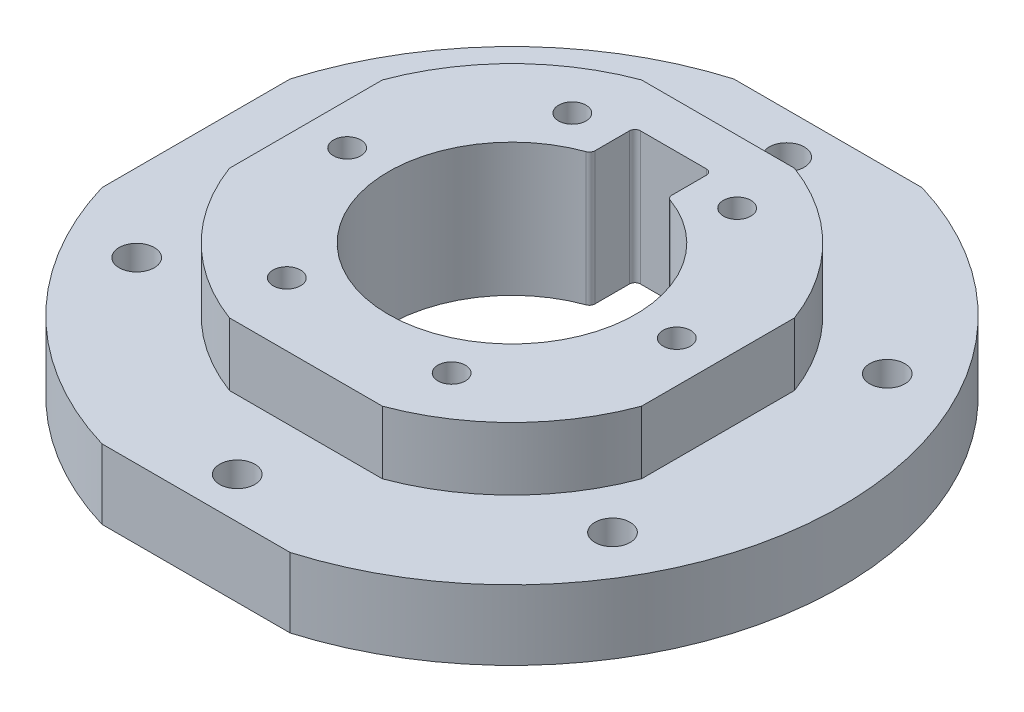
ISO-10303-21;
HEADER;
FILE_DESCRIPTION(('STEP AP214'),'2;1');
FILE_NAME('part.step','',(''),(''),'','','');
FILE_SCHEMA(('AUTOMOTIVE_DESIGN { 1 0 10303 214 1 1 1 1 }'));
ENDSEC;
DATA;
#1=APPLICATION_CONTEXT('core data for automotive mechanical design processes');
#2=APPLICATION_PROTOCOL_DEFINITION('international standard','automotive_design',2000,#1);
#3=PRODUCT_CONTEXT('',#1,'mechanical');
#4=PRODUCT('Part','Part','',(#3));
#5=PRODUCT_RELATED_PRODUCT_CATEGORY('part','',(#4));
#6=PRODUCT_DEFINITION_FORMATION('','',#4);
#7=PRODUCT_DEFINITION_CONTEXT('part definition',#1,'design');
#8=PRODUCT_DEFINITION('design','',#6,#7);
#9=PRODUCT_DEFINITION_SHAPE('','',#8);
#10=(LENGTH_UNIT() NAMED_UNIT(*) SI_UNIT(.MILLI.,.METRE.));
#11=(NAMED_UNIT(*) PLANE_ANGLE_UNIT() SI_UNIT($,.RADIAN.));
#12=(NAMED_UNIT(*) SI_UNIT($,.STERADIAN.) SOLID_ANGLE_UNIT());
#13=UNCERTAINTY_MEASURE_WITH_UNIT(LENGTH_MEASURE(1.E-05),#10,'distance_accuracy_value','');
#14=(GEOMETRIC_REPRESENTATION_CONTEXT(3) GLOBAL_UNCERTAINTY_ASSIGNED_CONTEXT((#13)) GLOBAL_UNIT_ASSIGNED_CONTEXT((#10,
#11,#12)) REPRESENTATION_CONTEXT('',''));
#15=CARTESIAN_POINT('',(0.,0.,0.));
#16=DIRECTION('',(0.,0.,1.));
#17=DIRECTION('',(1.,0.,0.));
#18=AXIS2_PLACEMENT_3D('',#15,#16,#17);
#19=CARTESIAN_POINT('',(0.,-12.7,0.));
#20=DIRECTION('',(0.,1.,0.));
#21=DIRECTION('',(0.,0.,1.));
#22=AXIS2_PLACEMENT_3D('',#19,#20,#21);
#23=CYLINDRICAL_SURFACE('',#22,22.5);
#24=CARTESIAN_POINT('',(0.,11.45,0.));
#25=DIRECTION('',(0.,1.,0.));
#26=DIRECTION('',(0.,0.,1.));
#27=AXIS2_PLACEMENT_3D('',#24,#25,#26);
#28=CIRCLE('',#27,22.5);
#29=CARTESIAN_POINT('',(-7.65957446808511,11.45,-21.1561083133893));
#30=VERTEX_POINT('',#29);
#31=CARTESIAN_POINT('',(7.65957446808511,11.45,-21.1561083133893));
#32=VERTEX_POINT('',#31);
#33=EDGE_CURVE('E414',#30,#32,#28,.T.);
#34=ORIENTED_EDGE('',*,*,#33,.T.);
#35=DIRECTION('',(0.,1.,0.));
#36=VECTOR('',#35,1.);
#37=CARTESIAN_POINT('',(7.65957446808511,-12.7,-21.1561083133893));
#38=LINE('',#37,#36);
#39=CARTESIAN_POINT('',(7.65957446808511,-12.7,-21.1561083133893));
#40=VERTEX_POINT('',#39);
#41=EDGE_CURVE('E57',#32,#40,#38,.F.);
#42=ORIENTED_EDGE('',*,*,#41,.T.);
#43=CARTESIAN_POINT('',(0.,-12.7,0.));
#44=DIRECTION('',(0.,1.,0.));
#45=DIRECTION('',(0.,0.,1.));
#46=AXIS2_PLACEMENT_3D('',#43,#44,#45);
#47=CIRCLE('',#46,22.5);
#48=CARTESIAN_POINT('',(-7.65957446808511,-12.7,-21.1561083133893));
#49=VERTEX_POINT('',#48);
#50=EDGE_CURVE('E295',#49,#40,#47,.T.);
#51=ORIENTED_EDGE('',*,*,#50,.F.);
#52=DIRECTION('',(0.,1.,0.));
#53=VECTOR('',#52,1.);
#54=CARTESIAN_POINT('',(-7.65957446808511,-12.7,-21.1561083133893));
#55=LINE('',#54,#53);
#56=EDGE_CURVE('E371',#49,#30,#55,.T.);
#57=ORIENTED_EDGE('',*,*,#56,.T.);
#58=EDGE_LOOP('',(#34,#42,#51,#57));
#59=FACE_BOUND('',#58,.T.);
#60=ADVANCED_FACE('F41',(#59),#23,.F.);
#61=CARTESIAN_POINT('',(7.00000000000001,-12.7,0.));
#62=DIRECTION('',(-1.,0.,0.));
#63=DIRECTION('',(0.,0.,1.));
#64=AXIS2_PLACEMENT_3D('',#61,#62,#63);
#65=PLANE('',#64);
#66=DIRECTION('',(0.,0.,1.));
#67=VECTOR('',#66,1.);
#68=CARTESIAN_POINT('',(7.00000000000001,11.45,0.));
#69=LINE('',#68,#67);
#70=CARTESIAN_POINT('',(7.,11.45,-28.3834047803431));
#71=VERTEX_POINT('',#70);
#72=CARTESIAN_POINT('',(7.,11.45,-22.0963797939844));
#73=VERTEX_POINT('',#72);
#74=EDGE_CURVE('E215',#71,#73,#69,.T.);
#75=ORIENTED_EDGE('',*,*,#74,.F.);
#76=DIRECTION('',(0.,1.,0.));
#77=VECTOR('',#76,1.);
#78=CARTESIAN_POINT('',(7.,-12.7,-28.3834047803431));
#79=LINE('',#78,#77);
#80=CARTESIAN_POINT('',(7.,-12.7,-28.3834047803431));
#81=VERTEX_POINT('',#80);
#82=EDGE_CURVE('E355',#71,#81,#79,.F.);
#83=ORIENTED_EDGE('',*,*,#82,.T.);
#84=DIRECTION('',(0.,0.,1.));
#85=VECTOR('',#84,1.);
#86=CARTESIAN_POINT('',(7.00000000000001,-12.7,0.));
#87=LINE('',#86,#85);
#88=CARTESIAN_POINT('',(7.,-12.7,-22.0963797939844));
#89=VERTEX_POINT('',#88);
#90=EDGE_CURVE('E306',#81,#89,#87,.T.);
#91=ORIENTED_EDGE('',*,*,#90,.T.);
#92=DIRECTION('',(0.,-1.,0.));
#93=VECTOR('',#92,1.);
#94=CARTESIAN_POINT('',(7.,11.45,-22.0963797939844));
#95=LINE('',#94,#93);
#96=EDGE_CURVE('E351',#89,#73,#95,.F.);
#97=ORIENTED_EDGE('',*,*,#96,.T.);
#98=EDGE_LOOP('',(#75,#83,#91,#97));
#99=FACE_BOUND('',#98,.T.);
#100=ADVANCED_FACE('F516',(#99),#65,.T.);
#101=CARTESIAN_POINT('',(0.,-12.7,-29.3834047803431));
#102=DIRECTION('',(0.,0.,1.));
#103=DIRECTION('',(1.,0.,0.));
#104=AXIS2_PLACEMENT_3D('',#101,#102,#103);
#105=PLANE('',#104);
#106=DIRECTION('',(1.,0.,0.));
#107=VECTOR('',#106,1.);
#108=CARTESIAN_POINT('',(0.,-12.7,-29.3834047803431));
#109=LINE('',#108,#107);
#110=CARTESIAN_POINT('',(-6.,-12.7,-29.3834047803431));
#111=VERTEX_POINT('',#110);
#112=CARTESIAN_POINT('',(6.,-12.7,-29.3834047803431));
#113=VERTEX_POINT('',#112);
#114=EDGE_CURVE('E302',#111,#113,#109,.T.);
#115=ORIENTED_EDGE('',*,*,#114,.T.);
#116=DIRECTION('',(0.,1.,0.));
#117=VECTOR('',#116,1.);
#118=CARTESIAN_POINT('',(6.,11.45,-29.3834047803431));
#119=LINE('',#118,#117);
#120=CARTESIAN_POINT('',(6.,11.45,-29.3834047803431));
#121=VERTEX_POINT('',#120);
#122=EDGE_CURVE('E347',#113,#121,#119,.T.);
#123=ORIENTED_EDGE('',*,*,#122,.T.);
#124=DIRECTION('',(1.,0.,0.));
#125=VECTOR('',#124,1.);
#126=CARTESIAN_POINT('',(0.,11.45,-29.3834047803431));
#127=LINE('',#126,#125);
#128=CARTESIAN_POINT('',(-6.,11.45,-29.3834047803431));
#129=VERTEX_POINT('',#128);
#130=EDGE_CURVE('E393',#129,#121,#127,.T.);
#131=ORIENTED_EDGE('',*,*,#130,.F.);
#132=DIRECTION('',(0.,1.,0.));
#133=VECTOR('',#132,1.);
#134=CARTESIAN_POINT('',(-6.,-12.7,-29.3834047803431));
#135=LINE('',#134,#133);
#136=EDGE_CURVE('E330',#129,#111,#135,.F.);
#137=ORIENTED_EDGE('',*,*,#136,.T.);
#138=EDGE_LOOP('',(#115,#123,#131,#137));
#139=FACE_BOUND('',#138,.T.);
#140=ADVANCED_FACE('F400',(#139),#105,.T.);
#141=CARTESIAN_POINT('',(0.,-12.7,57.5));
#142=DIRECTION('',(0.,0.,1.));
#143=DIRECTION('',(1.,0.,0.));
#144=AXIS2_PLACEMENT_3D('',#141,#142,#143);
#145=PLANE('',#144);
#146=DIRECTION('',(1.,0.,0.));
#147=VECTOR('',#146,1.);
#148=CARTESIAN_POINT('',(0.,0.,57.5));
#149=LINE('',#148,#147);
#150=CARTESIAN_POINT('',(-17.1391365010026,0.,57.5));
#151=VERTEX_POINT('',#150);
#152=CARTESIAN_POINT('',(17.1391365010026,0.,57.5));
#153=VERTEX_POINT('',#152);
#154=EDGE_CURVE('E276',#151,#153,#149,.T.);
#155=ORIENTED_EDGE('',*,*,#154,.F.);
#156=DIRECTION('',(0.,1.,0.));
#157=VECTOR('',#156,1.);
#158=CARTESIAN_POINT('',(-17.1391365010026,-12.7,57.5));
#159=LINE('',#158,#157);
#160=CARTESIAN_POINT('',(-17.1391365010026,-12.7,57.5));
#161=VERTEX_POINT('',#160);
#162=EDGE_CURVE('E327',#161,#151,#159,.T.);
#163=ORIENTED_EDGE('',*,*,#162,.F.);
#164=DIRECTION('',(1.,0.,0.));
#165=VECTOR('',#164,1.);
#166=CARTESIAN_POINT('',(0.,-12.7,57.5));
#167=LINE('',#166,#165);
#168=CARTESIAN_POINT('',(17.1391365010026,-12.7,57.5));
#169=VERTEX_POINT('',#168);
#170=EDGE_CURVE('E277',#161,#169,#167,.T.);
#171=ORIENTED_EDGE('',*,*,#170,.T.);
#172=DIRECTION('',(0.,1.,0.));
#173=VECTOR('',#172,1.);
#174=CARTESIAN_POINT('',(17.1391365010026,-12.7,57.5));
#175=LINE('',#174,#173);
#176=EDGE_CURVE('E310',#169,#153,#175,.T.);
#177=ORIENTED_EDGE('',*,*,#176,.T.);
#178=EDGE_LOOP('',(#155,#163,#171,#177));
#179=FACE_BOUND('',#178,.T.);
#180=ADVANCED_FACE('F530',(#179),#145,.T.);
#181=CARTESIAN_POINT('',(0.,-12.7,0.));
#182=DIRECTION('',(0.,1.,0.));
#183=DIRECTION('',(0.,0.,1.));
#184=AXIS2_PLACEMENT_3D('',#181,#182,#183);
#185=CYLINDRICAL_SURFACE('',#184,60.);
#186=CARTESIAN_POINT('',(0.,0.,0.));
#187=DIRECTION('',(0.,1.,0.));
#188=DIRECTION('',(0.,0.,1.));
#189=AXIS2_PLACEMENT_3D('',#186,#187,#188);
#190=CIRCLE('',#189,60.);
#191=CARTESIAN_POINT('',(-57.5,0.,17.1391365010026));
#192=VERTEX_POINT('',#191);
#193=EDGE_CURVE('E282',#192,#151,#190,.T.);
#194=ORIENTED_EDGE('',*,*,#193,.F.);
#195=DIRECTION('',(0.,1.,0.));
#196=VECTOR('',#195,1.);
#197=CARTESIAN_POINT('',(-57.5,-12.7,17.1391365010026));
#198=LINE('',#197,#196);
#199=CARTESIAN_POINT('',(-57.5,-12.7,17.1391365010026));
#200=VERTEX_POINT('',#199);
#201=EDGE_CURVE('E331',#200,#192,#198,.T.);
#202=ORIENTED_EDGE('',*,*,#201,.F.);
#203=CARTESIAN_POINT('',(0.,-12.7,0.));
#204=DIRECTION('',(0.,1.,0.));
#205=DIRECTION('',(0.,0.,1.));
#206=AXIS2_PLACEMENT_3D('',#203,#204,#205);
#207=CIRCLE('',#206,60.);
#208=EDGE_CURVE('E287',#200,#161,#207,.T.);
#209=ORIENTED_EDGE('',*,*,#208,.T.);
#210=ORIENTED_EDGE('',*,*,#162,.T.);
#211=EDGE_LOOP('',(#194,#202,#209,#210));
#212=FACE_BOUND('',#211,.T.);
#213=ADVANCED_FACE('F526',(#212),#185,.T.);
#214=CARTESIAN_POINT('',(-57.5,-12.7,0.));
#215=DIRECTION('',(-1.,0.,0.));
#216=DIRECTION('',(0.,0.,1.));
#217=AXIS2_PLACEMENT_3D('',#214,#215,#216);
#218=PLANE('',#217);
#219=DIRECTION('',(0.,0.,1.));
#220=VECTOR('',#219,1.);
#221=CARTESIAN_POINT('',(-57.5,0.,0.));
#222=LINE('',#221,#220);
#223=CARTESIAN_POINT('',(-57.5,0.,-17.1391365010026));
#224=VERTEX_POINT('',#223);
#225=EDGE_CURVE('E323',#224,#192,#222,.T.);
#226=ORIENTED_EDGE('',*,*,#225,.F.);
#227=DIRECTION('',(0.,1.,0.));
#228=VECTOR('',#227,1.);
#229=CARTESIAN_POINT('',(-57.5,-12.7,-17.1391365010026));
#230=LINE('',#229,#228);
#231=CARTESIAN_POINT('',(-57.5,-12.7,-17.1391365010026));
#232=VERTEX_POINT('',#231);
#233=EDGE_CURVE('E334',#232,#224,#230,.T.);
#234=ORIENTED_EDGE('',*,*,#233,.F.);
#235=DIRECTION('',(0.,0.,1.));
#236=VECTOR('',#235,1.);
#237=CARTESIAN_POINT('',(-57.5,-12.7,0.));
#238=LINE('',#237,#236);
#239=EDGE_CURVE('E291',#232,#200,#238,.T.);
#240=ORIENTED_EDGE('',*,*,#239,.T.);
#241=ORIENTED_EDGE('',*,*,#201,.T.);
#242=EDGE_LOOP('',(#226,#234,#240,#241));
#243=FACE_BOUND('',#242,.T.);
#244=ADVANCED_FACE('F529',(#243),#218,.T.);
#245=CARTESIAN_POINT('',(-17.1391365010026,0.,-57.5));
#246=VERTEX_POINT('',#245);
#247=EDGE_CURVE('E319',#246,#224,#190,.T.);
#248=ORIENTED_EDGE('',*,*,#247,.F.);
#249=DIRECTION('',(0.,1.,0.));
#250=VECTOR('',#249,1.);
#251=CARTESIAN_POINT('',(-17.1391365010026,-12.7,-57.5));
#252=LINE('',#251,#250);
#253=CARTESIAN_POINT('',(-17.1391365010026,-12.7,-57.5));
#254=VERTEX_POINT('',#253);
#255=EDGE_CURVE('E337',#254,#246,#252,.T.);
#256=ORIENTED_EDGE('',*,*,#255,.F.);
#257=EDGE_CURVE('E288',#254,#232,#207,.T.);
#258=ORIENTED_EDGE('',*,*,#257,.T.);
#259=ORIENTED_EDGE('',*,*,#233,.T.);
#260=EDGE_LOOP('',(#248,#256,#258,#259));
#261=FACE_BOUND('',#260,.T.);
#262=ADVANCED_FACE('F533',(#261),#185,.T.);
#263=CARTESIAN_POINT('',(0.,-12.7,-57.5));
#264=DIRECTION('',(0.,0.,1.));
#265=DIRECTION('',(1.,0.,0.));
#266=AXIS2_PLACEMENT_3D('',#263,#264,#265);
#267=PLANE('',#266);
#268=DIRECTION('',(1.,0.,0.));
#269=VECTOR('',#268,1.);
#270=CARTESIAN_POINT('',(0.,0.,-57.5));
#271=LINE('',#270,#269);
#272=CARTESIAN_POINT('',(17.1391365010026,0.,-57.5));
#273=VERTEX_POINT('',#272);
#274=EDGE_CURVE('E318',#246,#273,#271,.T.);
#275=ORIENTED_EDGE('',*,*,#274,.T.);
#276=DIRECTION('',(0.,1.,0.));
#277=VECTOR('',#276,1.);
#278=CARTESIAN_POINT('',(17.1391365010026,-12.7,-57.5));
#279=LINE('',#278,#277);
#280=CARTESIAN_POINT('',(17.1391365010026,-12.7,-57.5));
#281=VERTEX_POINT('',#280);
#282=EDGE_CURVE('E340',#281,#273,#279,.T.);
#283=ORIENTED_EDGE('',*,*,#282,.F.);
#284=DIRECTION('',(1.,0.,0.));
#285=VECTOR('',#284,1.);
#286=CARTESIAN_POINT('',(0.,-12.7,-57.5));
#287=LINE('',#286,#285);
#288=EDGE_CURVE('E286',#254,#281,#287,.T.);
#289=ORIENTED_EDGE('',*,*,#288,.F.);
#290=ORIENTED_EDGE('',*,*,#255,.T.);
#291=EDGE_LOOP('',(#275,#283,#289,#290));
#292=FACE_BOUND('',#291,.T.);
#293=ADVANCED_FACE('F537',(#292),#267,.F.);
#294=EDGE_CURVE('E314',#153,#273,#190,.T.);
#295=ORIENTED_EDGE('',*,*,#294,.F.);
#296=ORIENTED_EDGE('',*,*,#176,.F.);
#297=EDGE_CURVE('E281',#169,#281,#207,.T.);
#298=ORIENTED_EDGE('',*,*,#297,.T.);
#299=ORIENTED_EDGE('',*,*,#282,.T.);
#300=EDGE_LOOP('',(#295,#296,#298,#299));
#301=FACE_BOUND('',#300,.T.);
#302=ADVANCED_FACE('F532',(#301),#185,.T.);
#303=CARTESIAN_POINT('',(-7.,-12.7,0.));
#304=DIRECTION('',(1.,0.,0.));
#305=DIRECTION('',(0.,0.,-1.));
#306=AXIS2_PLACEMENT_3D('',#303,#304,#305);
#307=PLANE('',#306);
#308=DIRECTION('',(0.,0.,-1.));
#309=VECTOR('',#308,1.);
#310=CARTESIAN_POINT('',(-7.,-12.7,0.));
#311=LINE('',#310,#309);
#312=CARTESIAN_POINT('',(-7.,-12.7,-22.0963797939844));
#313=VERTEX_POINT('',#312);
#314=CARTESIAN_POINT('',(-7.,-12.7,-28.3834047803431));
#315=VERTEX_POINT('',#314);
#316=EDGE_CURVE('E298',#313,#315,#311,.T.);
#317=ORIENTED_EDGE('',*,*,#316,.T.);
#318=DIRECTION('',(0.,1.,0.));
#319=VECTOR('',#318,1.);
#320=CARTESIAN_POINT('',(-7.,11.45,-28.3834047803431));
#321=LINE('',#320,#319);
#322=CARTESIAN_POINT('',(-7.,11.45,-28.3834047803431));
#323=VERTEX_POINT('',#322);
#324=EDGE_CURVE('E361',#315,#323,#321,.T.);
#325=ORIENTED_EDGE('',*,*,#324,.T.);
#326=DIRECTION('',(0.,0.,-1.));
#327=VECTOR('',#326,1.);
#328=CARTESIAN_POINT('',(-7.,11.45,0.));
#329=LINE('',#328,#327);
#330=CARTESIAN_POINT('',(-7.,11.45,-22.0963797939844));
#331=VERTEX_POINT('',#330);
#332=EDGE_CURVE('E395',#331,#323,#329,.T.);
#333=ORIENTED_EDGE('',*,*,#332,.F.);
#334=DIRECTION('',(0.,-1.,0.));
#335=VECTOR('',#334,1.);
#336=CARTESIAN_POINT('',(-7.,-12.7,-22.0963797939844));
#337=LINE('',#336,#335);
#338=EDGE_CURVE('E358',#331,#313,#337,.T.);
#339=ORIENTED_EDGE('',*,*,#338,.T.);
#340=EDGE_LOOP('',(#317,#325,#333,#339));
#341=FACE_BOUND('',#340,.T.);
#342=ADVANCED_FACE('F409',(#341),#307,.T.);
#343=CARTESIAN_POINT('',(0.,-12.7,0.));
#344=DIRECTION('',(0.,1.,0.));
#345=DIRECTION('',(0.,0.,1.));
#346=AXIS2_PLACEMENT_3D('',#343,#344,#345);
#347=PLANE('',#346);
#348=CARTESIAN_POINT('',(-30.,-12.7,0.));
#349=DIRECTION('',(0.,1.,0.));
#350=DIRECTION('',(0.,0.,1.));
#351=AXIS2_PLACEMENT_3D('',#348,#349,#350);
#352=CIRCLE('',#351,2.5);
#353=CARTESIAN_POINT('',(-30.,-12.7,2.5));
#354=VERTEX_POINT('',#353);
#355=EDGE_CURVE('E953',#354,#354,#352,.T.);
#356=ORIENTED_EDGE('',*,*,#355,.T.);
#357=EDGE_LOOP('',(#356));
#358=FACE_BOUND('',#357,.T.);
#359=CARTESIAN_POINT('',(-15.,-12.7,-25.9807621135331));
#360=DIRECTION('',(0.,1.,0.));
#361=DIRECTION('',(0.,0.,1.));
#362=AXIS2_PLACEMENT_3D('',#359,#360,#361);
#363=CIRCLE('',#362,2.5);
#364=CARTESIAN_POINT('',(-15.,-12.7,-23.4807621135331));
#365=VERTEX_POINT('',#364);
#366=EDGE_CURVE('E963',#365,#365,#363,.T.);
#367=ORIENTED_EDGE('',*,*,#366,.T.);
#368=EDGE_LOOP('',(#367));
#369=FACE_BOUND('',#368,.T.);
#370=CARTESIAN_POINT('',(15.,-12.7,-25.9807621135332));
#371=DIRECTION('',(0.,1.,0.));
#372=DIRECTION('',(0.,0.,1.));
#373=AXIS2_PLACEMENT_3D('',#370,#371,#372);
#374=CIRCLE('',#373,2.5);
#375=CARTESIAN_POINT('',(15.,-12.7,-23.4807621135332));
#376=VERTEX_POINT('',#375);
#377=EDGE_CURVE('E967',#376,#376,#374,.T.);
#378=ORIENTED_EDGE('',*,*,#377,.T.);
#379=EDGE_LOOP('',(#378));
#380=FACE_BOUND('',#379,.T.);
#381=CARTESIAN_POINT('',(30.,-12.7,0.));
#382=DIRECTION('',(0.,1.,0.));
#383=DIRECTION('',(0.,0.,1.));
#384=AXIS2_PLACEMENT_3D('',#381,#382,#383);
#385=CIRCLE('',#384,2.5);
#386=CARTESIAN_POINT('',(30.,-12.7,2.49999999999999));
#387=VERTEX_POINT('',#386);
#388=EDGE_CURVE('E971',#387,#387,#385,.T.);
#389=ORIENTED_EDGE('',*,*,#388,.T.);
#390=EDGE_LOOP('',(#389));
#391=FACE_BOUND('',#390,.T.);
#392=CARTESIAN_POINT('',(15.,-12.7,25.9807621135331));
#393=DIRECTION('',(0.,1.,0.));
#394=DIRECTION('',(0.,0.,1.));
#395=AXIS2_PLACEMENT_3D('',#392,#393,#394);
#396=CIRCLE('',#395,2.5);
#397=CARTESIAN_POINT('',(15.,-12.7,28.4807621135331));
#398=VERTEX_POINT('',#397);
#399=EDGE_CURVE('E974',#398,#398,#396,.T.);
#400=ORIENTED_EDGE('',*,*,#399,.T.);
#401=EDGE_LOOP('',(#400));
#402=FACE_BOUND('',#401,.T.);
#403=CARTESIAN_POINT('',(-15.,-12.7,25.9807621135332));
#404=DIRECTION('',(0.,1.,0.));
#405=DIRECTION('',(0.,0.,1.));
#406=AXIS2_PLACEMENT_3D('',#403,#404,#405);
#407=CIRCLE('',#406,2.5);
#408=CARTESIAN_POINT('',(-15.,-12.7,28.4807621135332));
#409=VERTEX_POINT('',#408);
#410=EDGE_CURVE('E426',#409,#409,#407,.T.);
#411=ORIENTED_EDGE('',*,*,#410,.T.);
#412=EDGE_LOOP('',(#411));
#413=FACE_BOUND('',#412,.T.);
#414=CARTESIAN_POINT('',(-43.3012701892219,-12.7,25.));
#415=DIRECTION('',(0.,1.,0.));
#416=DIRECTION('',(0.,0.,1.));
#417=AXIS2_PLACEMENT_3D('',#414,#415,#416);
#418=CIRCLE('',#417,3.2);
#419=CARTESIAN_POINT('',(-43.3012701892219,-12.7,28.2));
#420=VERTEX_POINT('',#419);
#421=EDGE_CURVE('E227',#420,#420,#418,.T.);
#422=ORIENTED_EDGE('',*,*,#421,.T.);
#423=EDGE_LOOP('',(#422));
#424=FACE_BOUND('',#423,.T.);
#425=CARTESIAN_POINT('',(0.,-12.7,-50.));
#426=DIRECTION('',(0.,1.,0.));
#427=DIRECTION('',(0.,0.,1.));
#428=AXIS2_PLACEMENT_3D('',#425,#426,#427);
#429=CIRCLE('',#428,3.2);
#430=CARTESIAN_POINT('',(0.,-12.7,-46.8));
#431=VERTEX_POINT('',#430);
#432=EDGE_CURVE('E240',#431,#431,#429,.T.);
#433=ORIENTED_EDGE('',*,*,#432,.T.);
#434=EDGE_LOOP('',(#433));
#435=FACE_BOUND('',#434,.T.);
#436=CARTESIAN_POINT('',(43.3012701892219,-12.7,-25.));
#437=DIRECTION('',(0.,1.,0.));
#438=DIRECTION('',(0.,0.,1.));
#439=AXIS2_PLACEMENT_3D('',#436,#437,#438);
#440=CIRCLE('',#439,3.2);
#441=CARTESIAN_POINT('',(43.3012701892219,-12.7,-21.8));
#442=VERTEX_POINT('',#441);
#443=EDGE_CURVE('E248',#442,#442,#440,.T.);
#444=ORIENTED_EDGE('',*,*,#443,.T.);
#445=EDGE_LOOP('',(#444));
#446=FACE_BOUND('',#445,.T.);
#447=CARTESIAN_POINT('',(43.3012701892219,-12.7,25.));
#448=DIRECTION('',(0.,1.,0.));
#449=DIRECTION('',(0.,0.,1.));
#450=AXIS2_PLACEMENT_3D('',#447,#448,#449);
#451=CIRCLE('',#450,3.2);
#452=CARTESIAN_POINT('',(43.3012701892219,-12.7,28.2));
#453=VERTEX_POINT('',#452);
#454=EDGE_CURVE('E256',#453,#453,#451,.T.);
#455=ORIENTED_EDGE('',*,*,#454,.T.);
#456=EDGE_LOOP('',(#455));
#457=FACE_BOUND('',#456,.T.);
#458=CARTESIAN_POINT('',(0.,-12.7,50.));
#459=DIRECTION('',(0.,1.,0.));
#460=DIRECTION('',(0.,0.,1.));
#461=AXIS2_PLACEMENT_3D('',#458,#459,#460);
#462=CIRCLE('',#461,3.2);
#463=CARTESIAN_POINT('',(0.,-12.7,53.2));
#464=VERTEX_POINT('',#463);
#465=EDGE_CURVE('E264',#464,#464,#462,.T.);
#466=ORIENTED_EDGE('',*,*,#465,.T.);
#467=EDGE_LOOP('',(#466));
#468=FACE_BOUND('',#467,.T.);
#469=CARTESIAN_POINT('',(-43.301270189222,-12.7,-25.));
#470=DIRECTION('',(0.,1.,0.));
#471=DIRECTION('',(0.,0.,1.));
#472=AXIS2_PLACEMENT_3D('',#469,#470,#471);
#473=CIRCLE('',#472,3.2);
#474=CARTESIAN_POINT('',(-43.301270189222,-12.7,-21.8));
#475=VERTEX_POINT('',#474);
#476=EDGE_CURVE('E272',#475,#475,#473,.T.);
#477=ORIENTED_EDGE('',*,*,#476,.T.);
#478=EDGE_LOOP('',(#477));
#479=FACE_BOUND('',#478,.T.);
#480=ORIENTED_EDGE('',*,*,#170,.F.);
#481=ORIENTED_EDGE('',*,*,#208,.F.);
#482=ORIENTED_EDGE('',*,*,#239,.F.);
#483=ORIENTED_EDGE('',*,*,#257,.F.);
#484=ORIENTED_EDGE('',*,*,#288,.T.);
#485=ORIENTED_EDGE('',*,*,#297,.F.);
#486=EDGE_LOOP('',(#480,#481,#482,#483,#484,#485));
#487=FACE_BOUND('',#486,.T.);
#488=ORIENTED_EDGE('',*,*,#50,.T.);
#489=CARTESIAN_POINT('',(8.,-12.7,-22.0963797939844));
#490=DIRECTION('',(0.,1.,0.));
#491=DIRECTION('',(0.,0.,1.));
#492=AXIS2_PLACEMENT_3D('',#489,#490,#491);
#493=CIRCLE('',#492,1.);
#494=EDGE_CURVE('E379',#40,#89,#493,.F.);
#495=ORIENTED_EDGE('',*,*,#494,.T.);
#496=ORIENTED_EDGE('',*,*,#90,.F.);
#497=CARTESIAN_POINT('',(6.,-12.7,-28.3834047803431));
#498=DIRECTION('',(0.,1.,0.));
#499=DIRECTION('',(0.,0.,1.));
#500=AXIS2_PLACEMENT_3D('',#497,#498,#499);
#501=CIRCLE('',#500,1.);
#502=EDGE_CURVE('E385',#81,#113,#501,.T.);
#503=ORIENTED_EDGE('',*,*,#502,.T.);
#504=ORIENTED_EDGE('',*,*,#114,.F.);
#505=CARTESIAN_POINT('',(-6.,-12.7,-28.3834047803431));
#506=DIRECTION('',(0.,1.,0.));
#507=DIRECTION('',(0.,0.,1.));
#508=AXIS2_PLACEMENT_3D('',#505,#506,#507);
#509=CIRCLE('',#508,1.);
#510=EDGE_CURVE('E11',#111,#315,#509,.T.);
#511=ORIENTED_EDGE('',*,*,#510,.T.);
#512=ORIENTED_EDGE('',*,*,#316,.F.);
#513=CARTESIAN_POINT('',(-8.,-12.7,-22.0963797939844));
#514=DIRECTION('',(0.,1.,0.));
#515=DIRECTION('',(0.,0.,1.));
#516=AXIS2_PLACEMENT_3D('',#513,#514,#515);
#517=CIRCLE('',#516,1.);
#518=EDGE_CURVE('E64',#313,#49,#517,.F.);
#519=ORIENTED_EDGE('',*,*,#518,.T.);
#520=EDGE_LOOP('',(#488,#495,#496,#503,#504,#511,#512,#519));
#521=FACE_BOUND('',#520,.T.);
#522=ADVANCED_FACE('F407',(#358,#369,#380,#391,#402,#413,#424,#435,#446,#457,#468,#479,#487,
#521),#347,.F.);
#523=CARTESIAN_POINT('',(0.,0.,0.));
#524=DIRECTION('',(0.,1.,0.));
#525=DIRECTION('',(0.,0.,1.));
#526=AXIS2_PLACEMENT_3D('',#523,#524,#525);
#527=PLANE('',#526);
#528=CARTESIAN_POINT('',(0.,0.,0.));
#529=DIRECTION('',(0.,1.,0.));
#530=DIRECTION('',(0.,0.,1.));
#531=AXIS2_PLACEMENT_3D('',#528,#529,#530);
#532=CIRCLE('',#531,40.);
#533=CARTESIAN_POINT('',(13.9194109070751,0.,37.5));
#534=VERTEX_POINT('',#533);
#535=CARTESIAN_POINT('',(37.5,0.,13.9194109070751));
#536=VERTEX_POINT('',#535);
#537=EDGE_CURVE('E424',#534,#536,#532,.T.);
#538=ORIENTED_EDGE('',*,*,#537,.F.);
#539=DIRECTION('',(1.,0.,0.));
#540=VECTOR('',#539,1.);
#541=CARTESIAN_POINT('',(0.,0.,37.5));
#542=LINE('',#541,#540);
#543=CARTESIAN_POINT('',(-13.9194109070751,0.,37.5));
#544=VERTEX_POINT('',#543);
#545=EDGE_CURVE('E219',#544,#534,#542,.T.);
#546=ORIENTED_EDGE('',*,*,#545,.F.);
#547=CARTESIAN_POINT('',(-37.5,0.,13.9194109070751));
#548=VERTEX_POINT('',#547);
#549=EDGE_CURVE('E416',#548,#544,#532,.T.);
#550=ORIENTED_EDGE('',*,*,#549,.F.);
#551=DIRECTION('',(0.,0.,1.));
#552=VECTOR('',#551,1.);
#553=CARTESIAN_POINT('',(-37.5,0.,0.));
#554=LINE('',#553,#552);
#555=CARTESIAN_POINT('',(-37.5,0.,-13.9194109070751));
#556=VERTEX_POINT('',#555);
#557=EDGE_CURVE('E421',#556,#548,#554,.T.);
#558=ORIENTED_EDGE('',*,*,#557,.F.);
#559=CARTESIAN_POINT('',(-13.9194109070751,0.,-37.5));
#560=VERTEX_POINT('',#559);
#561=EDGE_CURVE('E423',#560,#556,#532,.T.);
#562=ORIENTED_EDGE('',*,*,#561,.F.);
#563=DIRECTION('',(1.,0.,0.));
#564=VECTOR('',#563,1.);
#565=CARTESIAN_POINT('',(0.,0.,-37.5));
#566=LINE('',#565,#564);
#567=CARTESIAN_POINT('',(13.9194109070751,0.,-37.5));
#568=VERTEX_POINT('',#567);
#569=EDGE_CURVE('E449',#560,#568,#566,.T.);
#570=ORIENTED_EDGE('',*,*,#569,.T.);
#571=CARTESIAN_POINT('',(37.5,0.,-13.9194109070751));
#572=VERTEX_POINT('',#571);
#573=EDGE_CURVE('E445',#572,#568,#532,.T.);
#574=ORIENTED_EDGE('',*,*,#573,.F.);
#575=DIRECTION('',(0.,0.,1.));
#576=VECTOR('',#575,1.);
#577=CARTESIAN_POINT('',(37.5,0.,0.));
#578=LINE('',#577,#576);
#579=EDGE_CURVE('E444',#572,#536,#578,.T.);
#580=ORIENTED_EDGE('',*,*,#579,.T.);
#581=EDGE_LOOP('',(#538,#546,#550,#558,#562,#570,#574,#580));
#582=FACE_BOUND('',#581,.T.);
#583=CARTESIAN_POINT('',(-43.3012701892219,0.,25.));
#584=DIRECTION('',(0.,1.,0.));
#585=DIRECTION('',(0.,0.,1.));
#586=AXIS2_PLACEMENT_3D('',#583,#584,#585);
#587=CIRCLE('',#586,3.2);
#588=CARTESIAN_POINT('',(-43.3012701892219,0.,28.2));
#589=VERTEX_POINT('',#588);
#590=EDGE_CURVE('E222',#589,#589,#587,.T.);
#591=ORIENTED_EDGE('',*,*,#590,.F.);
#592=EDGE_LOOP('',(#591));
#593=FACE_BOUND('',#592,.T.);
#594=CARTESIAN_POINT('',(0.,0.,-50.));
#595=DIRECTION('',(0.,1.,0.));
#596=DIRECTION('',(0.,0.,1.));
#597=AXIS2_PLACEMENT_3D('',#594,#595,#596);
#598=CIRCLE('',#597,3.2);
#599=CARTESIAN_POINT('',(0.,0.,-46.8));
#600=VERTEX_POINT('',#599);
#601=EDGE_CURVE('E236',#600,#600,#598,.T.);
#602=ORIENTED_EDGE('',*,*,#601,.F.);
#603=EDGE_LOOP('',(#602));
#604=FACE_BOUND('',#603,.T.);
#605=CARTESIAN_POINT('',(43.3012701892219,0.,-25.));
#606=DIRECTION('',(0.,1.,0.));
#607=DIRECTION('',(0.,0.,1.));
#608=AXIS2_PLACEMENT_3D('',#605,#606,#607);
#609=CIRCLE('',#608,3.2);
#610=CARTESIAN_POINT('',(43.3012701892219,0.,-21.8));
#611=VERTEX_POINT('',#610);
#612=EDGE_CURVE('E244',#611,#611,#609,.T.);
#613=ORIENTED_EDGE('',*,*,#612,.F.);
#614=EDGE_LOOP('',(#613));
#615=FACE_BOUND('',#614,.T.);
#616=CARTESIAN_POINT('',(43.3012701892219,0.,25.));
#617=DIRECTION('',(0.,1.,0.));
#618=DIRECTION('',(0.,0.,1.));
#619=AXIS2_PLACEMENT_3D('',#616,#617,#618);
#620=CIRCLE('',#619,3.2);
#621=CARTESIAN_POINT('',(43.3012701892219,0.,28.2));
#622=VERTEX_POINT('',#621);
#623=EDGE_CURVE('E252',#622,#622,#620,.T.);
#624=ORIENTED_EDGE('',*,*,#623,.F.);
#625=EDGE_LOOP('',(#624));
#626=FACE_BOUND('',#625,.T.);
#627=CARTESIAN_POINT('',(0.,0.,50.));
#628=DIRECTION('',(0.,1.,0.));
#629=DIRECTION('',(0.,0.,1.));
#630=AXIS2_PLACEMENT_3D('',#627,#628,#629);
#631=CIRCLE('',#630,3.2);
#632=CARTESIAN_POINT('',(0.,0.,53.2));
#633=VERTEX_POINT('',#632);
#634=EDGE_CURVE('E260',#633,#633,#631,.T.);
#635=ORIENTED_EDGE('',*,*,#634,.F.);
#636=EDGE_LOOP('',(#635));
#637=FACE_BOUND('',#636,.T.);
#638=CARTESIAN_POINT('',(-43.301270189222,0.,-25.));
#639=DIRECTION('',(0.,1.,0.));
#640=DIRECTION('',(0.,0.,1.));
#641=AXIS2_PLACEMENT_3D('',#638,#639,#640);
#642=CIRCLE('',#641,3.2);
#643=CARTESIAN_POINT('',(-43.301270189222,0.,-21.8));
#644=VERTEX_POINT('',#643);
#645=EDGE_CURVE('E268',#644,#644,#642,.T.);
#646=ORIENTED_EDGE('',*,*,#645,.F.);
#647=EDGE_LOOP('',(#646));
#648=FACE_BOUND('',#647,.T.);
#649=ORIENTED_EDGE('',*,*,#154,.T.);
#650=ORIENTED_EDGE('',*,*,#294,.T.);
#651=ORIENTED_EDGE('',*,*,#274,.F.);
#652=ORIENTED_EDGE('',*,*,#247,.T.);
#653=ORIENTED_EDGE('',*,*,#225,.T.);
#654=ORIENTED_EDGE('',*,*,#193,.T.);
#655=EDGE_LOOP('',(#649,#650,#651,#652,#653,#654));
#656=FACE_BOUND('',#655,.T.);
#657=ADVANCED_FACE('F482',(#582,#593,#604,#615,#626,#637,#648,#656),#527,.T.);
#658=CARTESIAN_POINT('',(-43.301270189222,0.,-25.));
#659=DIRECTION('',(0.,1.,0.));
#660=DIRECTION('',(0.,0.,1.));
#661=AXIS2_PLACEMENT_3D('',#658,#659,#660);
#662=CYLINDRICAL_SURFACE('',#661,3.2);
#663=ORIENTED_EDGE('',*,*,#476,.F.);
#664=EDGE_LOOP('',(#663));
#665=FACE_BOUND('',#664,.T.);
#666=ORIENTED_EDGE('',*,*,#645,.T.);
#667=EDGE_LOOP('',(#666));
#668=FACE_BOUND('',#667,.T.);
#669=ADVANCED_FACE('F758',(#665,#668),#662,.F.);
#670=CARTESIAN_POINT('',(0.,0.,50.));
#671=DIRECTION('',(0.,1.,0.));
#672=DIRECTION('',(0.,0.,1.));
#673=AXIS2_PLACEMENT_3D('',#670,#671,#672);
#674=CYLINDRICAL_SURFACE('',#673,3.2);
#675=ORIENTED_EDGE('',*,*,#465,.F.);
#676=EDGE_LOOP('',(#675));
#677=FACE_BOUND('',#676,.T.);
#678=ORIENTED_EDGE('',*,*,#634,.T.);
#679=EDGE_LOOP('',(#678));
#680=FACE_BOUND('',#679,.T.);
#681=ADVANCED_FACE('F798',(#677,#680),#674,.F.);
#682=CARTESIAN_POINT('',(43.3012701892219,0.,25.));
#683=DIRECTION('',(0.,1.,0.));
#684=DIRECTION('',(0.,0.,1.));
#685=AXIS2_PLACEMENT_3D('',#682,#683,#684);
#686=CYLINDRICAL_SURFACE('',#685,3.2);
#687=ORIENTED_EDGE('',*,*,#454,.F.);
#688=EDGE_LOOP('',(#687));
#689=FACE_BOUND('',#688,.T.);
#690=ORIENTED_EDGE('',*,*,#623,.T.);
#691=EDGE_LOOP('',(#690));
#692=FACE_BOUND('',#691,.T.);
#693=ADVANCED_FACE('F788',(#689,#692),#686,.F.);
#694=CARTESIAN_POINT('',(43.3012701892219,0.,-25.));
#695=DIRECTION('',(0.,1.,0.));
#696=DIRECTION('',(0.,0.,1.));
#697=AXIS2_PLACEMENT_3D('',#694,#695,#696);
#698=CYLINDRICAL_SURFACE('',#697,3.2);
#699=ORIENTED_EDGE('',*,*,#443,.F.);
#700=EDGE_LOOP('',(#699));
#701=FACE_BOUND('',#700,.T.);
#702=ORIENTED_EDGE('',*,*,#612,.T.);
#703=EDGE_LOOP('',(#702));
#704=FACE_BOUND('',#703,.T.);
#705=ADVANCED_FACE('F778',(#701,#704),#698,.F.);
#706=CARTESIAN_POINT('',(0.,0.,-50.));
#707=DIRECTION('',(0.,1.,0.));
#708=DIRECTION('',(0.,0.,1.));
#709=AXIS2_PLACEMENT_3D('',#706,#707,#708);
#710=CYLINDRICAL_SURFACE('',#709,3.2);
#711=ORIENTED_EDGE('',*,*,#432,.F.);
#712=EDGE_LOOP('',(#711));
#713=FACE_BOUND('',#712,.T.);
#714=ORIENTED_EDGE('',*,*,#601,.T.);
#715=EDGE_LOOP('',(#714));
#716=FACE_BOUND('',#715,.T.);
#717=ADVANCED_FACE('F768',(#713,#716),#710,.F.);
#718=CARTESIAN_POINT('',(-43.3012701892219,0.,25.));
#719=DIRECTION('',(0.,1.,0.));
#720=DIRECTION('',(0.,0.,1.));
#721=AXIS2_PLACEMENT_3D('',#718,#719,#720);
#722=CYLINDRICAL_SURFACE('',#721,3.2);
#723=ORIENTED_EDGE('',*,*,#421,.F.);
#724=EDGE_LOOP('',(#723));
#725=FACE_BOUND('',#724,.T.);
#726=ORIENTED_EDGE('',*,*,#590,.T.);
#727=EDGE_LOOP('',(#726));
#728=FACE_BOUND('',#727,.T.);
#729=ADVANCED_FACE('F749',(#725,#728),#722,.F.);
#730=CARTESIAN_POINT('',(0.,11.45,37.5));
#731=DIRECTION('',(0.,0.,-1.));
#732=DIRECTION('',(-1.,0.,0.));
#733=AXIS2_PLACEMENT_3D('',#730,#731,#732);
#734=PLANE('',#733);
#735=ORIENTED_EDGE('',*,*,#545,.T.);
#736=DIRECTION('',(0.,-1.,0.));
#737=VECTOR('',#736,1.);
#738=CARTESIAN_POINT('',(13.9194109070751,11.45,37.5));
#739=LINE('',#738,#737);
#740=CARTESIAN_POINT('',(13.9194109070751,11.45,37.5));
#741=VERTEX_POINT('',#740);
#742=EDGE_CURVE('E196',#741,#534,#739,.T.);
#743=ORIENTED_EDGE('',*,*,#742,.F.);
#744=DIRECTION('',(1.,0.,0.));
#745=VECTOR('',#744,1.);
#746=CARTESIAN_POINT('',(0.,11.45,37.5));
#747=LINE('',#746,#745);
#748=CARTESIAN_POINT('',(-13.9194109070751,11.45,37.5));
#749=VERTEX_POINT('',#748);
#750=EDGE_CURVE('E204',#749,#741,#747,.T.);
#751=ORIENTED_EDGE('',*,*,#750,.F.);
#752=DIRECTION('',(0.,-1.,0.));
#753=VECTOR('',#752,1.);
#754=CARTESIAN_POINT('',(-13.9194109070751,11.45,37.5));
#755=LINE('',#754,#753);
#756=EDGE_CURVE('E456',#749,#544,#755,.T.);
#757=ORIENTED_EDGE('',*,*,#756,.T.);
#758=EDGE_LOOP('',(#735,#743,#751,#757));
#759=FACE_BOUND('',#758,.T.);
#760=ADVANCED_FACE('F217',(#759),#734,.F.);
#761=CARTESIAN_POINT('',(0.,11.45,0.));
#762=DIRECTION('',(0.,-1.,0.));
#763=DIRECTION('',(0.,0.,-1.));
#764=AXIS2_PLACEMENT_3D('',#761,#762,#763);
#765=CYLINDRICAL_SURFACE('',#764,40.);
#766=ORIENTED_EDGE('',*,*,#537,.T.);
#767=DIRECTION('',(0.,-1.,0.));
#768=VECTOR('',#767,1.);
#769=CARTESIAN_POINT('',(37.5,11.45,13.9194109070751));
#770=LINE('',#769,#768);
#771=CARTESIAN_POINT('',(37.5,11.45,13.9194109070751));
#772=VERTEX_POINT('',#771);
#773=EDGE_CURVE('E198',#772,#536,#770,.T.);
#774=ORIENTED_EDGE('',*,*,#773,.F.);
#775=CARTESIAN_POINT('',(0.,11.45,0.));
#776=DIRECTION('',(0.,1.,0.));
#777=DIRECTION('',(0.,0.,1.));
#778=AXIS2_PLACEMENT_3D('',#775,#776,#777);
#779=CIRCLE('',#778,40.);
#780=EDGE_CURVE('E191',#741,#772,#779,.T.);
#781=ORIENTED_EDGE('',*,*,#780,.F.);
#782=ORIENTED_EDGE('',*,*,#742,.T.);
#783=EDGE_LOOP('',(#766,#774,#781,#782));
#784=FACE_BOUND('',#783,.T.);
#785=ADVANCED_FACE('F194',(#784),#765,.T.);
#786=CARTESIAN_POINT('',(37.5,11.45,0.));
#787=DIRECTION('',(1.,0.,0.));
#788=DIRECTION('',(0.,0.,-1.));
#789=AXIS2_PLACEMENT_3D('',#786,#787,#788);
#790=PLANE('',#789);
#791=ORIENTED_EDGE('',*,*,#579,.F.);
#792=DIRECTION('',(0.,-1.,0.));
#793=VECTOR('',#792,1.);
#794=CARTESIAN_POINT('',(37.5,11.45,-13.9194109070751));
#795=LINE('',#794,#793);
#796=CARTESIAN_POINT('',(37.5,11.45,-13.9194109070751));
#797=VERTEX_POINT('',#796);
#798=EDGE_CURVE('E229',#797,#572,#795,.T.);
#799=ORIENTED_EDGE('',*,*,#798,.F.);
#800=DIRECTION('',(0.,0.,1.));
#801=VECTOR('',#800,1.);
#802=CARTESIAN_POINT('',(37.5,11.45,0.));
#803=LINE('',#802,#801);
#804=EDGE_CURVE('E203',#797,#772,#803,.T.);
#805=ORIENTED_EDGE('',*,*,#804,.T.);
#806=ORIENTED_EDGE('',*,*,#773,.T.);
#807=EDGE_LOOP('',(#791,#799,#805,#806));
#808=FACE_BOUND('',#807,.T.);
#809=ADVANCED_FACE('F480',(#808),#790,.T.);
#810=ORIENTED_EDGE('',*,*,#573,.T.);
#811=DIRECTION('',(0.,-1.,0.));
#812=VECTOR('',#811,1.);
#813=CARTESIAN_POINT('',(13.9194109070751,11.45,-37.5));
#814=LINE('',#813,#812);
#815=CARTESIAN_POINT('',(13.9194109070751,11.45,-37.5));
#816=VERTEX_POINT('',#815);
#817=EDGE_CURVE('E469',#816,#568,#814,.T.);
#818=ORIENTED_EDGE('',*,*,#817,.F.);
#819=EDGE_CURVE('E207',#797,#816,#779,.T.);
#820=ORIENTED_EDGE('',*,*,#819,.F.);
#821=ORIENTED_EDGE('',*,*,#798,.T.);
#822=EDGE_LOOP('',(#810,#818,#820,#821));
#823=FACE_BOUND('',#822,.T.);
#824=ADVANCED_FACE('F476',(#823),#765,.T.);
#825=CARTESIAN_POINT('',(0.,11.45,-37.5));
#826=DIRECTION('',(0.,0.,-1.));
#827=DIRECTION('',(-1.,0.,0.));
#828=AXIS2_PLACEMENT_3D('',#825,#826,#827);
#829=PLANE('',#828);
#830=ORIENTED_EDGE('',*,*,#569,.F.);
#831=DIRECTION('',(0.,-1.,0.));
#832=VECTOR('',#831,1.);
#833=CARTESIAN_POINT('',(-13.9194109070751,11.45,-37.5));
#834=LINE('',#833,#832);
#835=CARTESIAN_POINT('',(-13.9194109070751,11.45,-37.5));
#836=VERTEX_POINT('',#835);
#837=EDGE_CURVE('E466',#836,#560,#834,.T.);
#838=ORIENTED_EDGE('',*,*,#837,.F.);
#839=DIRECTION('',(1.,0.,0.));
#840=VECTOR('',#839,1.);
#841=CARTESIAN_POINT('',(0.,11.45,-37.5));
#842=LINE('',#841,#840);
#843=EDGE_CURVE('E433',#836,#816,#842,.T.);
#844=ORIENTED_EDGE('',*,*,#843,.T.);
#845=ORIENTED_EDGE('',*,*,#817,.T.);
#846=EDGE_LOOP('',(#830,#838,#844,#845));
#847=FACE_BOUND('',#846,.T.);
#848=ADVANCED_FACE('F505',(#847),#829,.T.);
#849=ORIENTED_EDGE('',*,*,#561,.T.);
#850=DIRECTION('',(0.,-1.,0.));
#851=VECTOR('',#850,1.);
#852=CARTESIAN_POINT('',(-37.5,11.45,-13.9194109070751));
#853=LINE('',#852,#851);
#854=CARTESIAN_POINT('',(-37.5,11.45,-13.9194109070751));
#855=VERTEX_POINT('',#854);
#856=EDGE_CURVE('E462',#855,#556,#853,.T.);
#857=ORIENTED_EDGE('',*,*,#856,.F.);
#858=EDGE_CURVE('E437',#836,#855,#779,.T.);
#859=ORIENTED_EDGE('',*,*,#858,.F.);
#860=ORIENTED_EDGE('',*,*,#837,.T.);
#861=EDGE_LOOP('',(#849,#857,#859,#860));
#862=FACE_BOUND('',#861,.T.);
#863=ADVANCED_FACE('F490',(#862),#765,.T.);
#864=CARTESIAN_POINT('',(-37.5,11.45,0.));
#865=DIRECTION('',(1.,0.,0.));
#866=DIRECTION('',(0.,0.,-1.));
#867=AXIS2_PLACEMENT_3D('',#864,#865,#866);
#868=PLANE('',#867);
#869=ORIENTED_EDGE('',*,*,#557,.T.);
#870=DIRECTION('',(0.,-1.,0.));
#871=VECTOR('',#870,1.);
#872=CARTESIAN_POINT('',(-37.5,11.45,13.9194109070751));
#873=LINE('',#872,#871);
#874=CARTESIAN_POINT('',(-37.5,11.45,13.9194109070751));
#875=VERTEX_POINT('',#874);
#876=EDGE_CURVE('E459',#875,#548,#873,.T.);
#877=ORIENTED_EDGE('',*,*,#876,.F.);
#878=DIRECTION('',(0.,0.,1.));
#879=VECTOR('',#878,1.);
#880=CARTESIAN_POINT('',(-37.5,11.45,0.));
#881=LINE('',#880,#879);
#882=EDGE_CURVE('E438',#855,#875,#881,.T.);
#883=ORIENTED_EDGE('',*,*,#882,.F.);
#884=ORIENTED_EDGE('',*,*,#856,.T.);
#885=EDGE_LOOP('',(#869,#877,#883,#884));
#886=FACE_BOUND('',#885,.T.);
#887=ADVANCED_FACE('F495',(#886),#868,.F.);
#888=ORIENTED_EDGE('',*,*,#549,.T.);
#889=ORIENTED_EDGE('',*,*,#756,.F.);
#890=EDGE_CURVE('E206',#875,#749,#779,.T.);
#891=ORIENTED_EDGE('',*,*,#890,.F.);
#892=ORIENTED_EDGE('',*,*,#876,.T.);
#893=EDGE_LOOP('',(#888,#889,#891,#892));
#894=FACE_BOUND('',#893,.T.);
#895=ADVANCED_FACE('F499',(#894),#765,.T.);
#896=CARTESIAN_POINT('',(0.,11.45,0.));
#897=DIRECTION('',(0.,1.,0.));
#898=DIRECTION('',(0.,0.,1.));
#899=AXIS2_PLACEMENT_3D('',#896,#897,#898);
#900=PLANE('',#899);
#901=CARTESIAN_POINT('',(30.,11.45,0.));
#902=DIRECTION('',(0.,1.,0.));
#903=DIRECTION('',(0.,0.,1.));
#904=AXIS2_PLACEMENT_3D('',#901,#902,#903);
#905=CIRCLE('',#904,2.5);
#906=CARTESIAN_POINT('',(30.,11.45,2.49999999999999));
#907=VERTEX_POINT('',#906);
#908=EDGE_CURVE('E989',#907,#907,#905,.T.);
#909=ORIENTED_EDGE('',*,*,#908,.F.);
#910=EDGE_LOOP('',(#909));
#911=FACE_BOUND('',#910,.T.);
#912=CARTESIAN_POINT('',(-15.,11.45,-25.9807621135331));
#913=DIRECTION('',(0.,1.,0.));
#914=DIRECTION('',(0.,0.,1.));
#915=AXIS2_PLACEMENT_3D('',#912,#913,#914);
#916=CIRCLE('',#915,2.49999999999999);
#917=CARTESIAN_POINT('',(-15.,11.45,-23.4807621135332));
#918=VERTEX_POINT('',#917);
#919=EDGE_CURVE('E986',#918,#918,#916,.T.);
#920=ORIENTED_EDGE('',*,*,#919,.F.);
#921=EDGE_LOOP('',(#920));
#922=FACE_BOUND('',#921,.T.);
#923=CARTESIAN_POINT('',(15.,11.45,25.9807621135331));
#924=DIRECTION('',(0.,1.,0.));
#925=DIRECTION('',(0.,0.,1.));
#926=AXIS2_PLACEMENT_3D('',#923,#924,#925);
#927=CIRCLE('',#926,2.49999999999999);
#928=CARTESIAN_POINT('',(15.,11.45,28.4807621135331));
#929=VERTEX_POINT('',#928);
#930=EDGE_CURVE('E956',#929,#929,#927,.T.);
#931=ORIENTED_EDGE('',*,*,#930,.F.);
#932=EDGE_LOOP('',(#931));
#933=FACE_BOUND('',#932,.T.);
#934=CARTESIAN_POINT('',(-30.,11.45,0.));
#935=DIRECTION('',(0.,1.,0.));
#936=DIRECTION('',(0.,0.,1.));
#937=AXIS2_PLACEMENT_3D('',#934,#935,#936);
#938=CIRCLE('',#937,2.49999999999999);
#939=CARTESIAN_POINT('',(-30.,11.45,2.49999999999999));
#940=VERTEX_POINT('',#939);
#941=EDGE_CURVE('E948',#940,#940,#938,.T.);
#942=ORIENTED_EDGE('',*,*,#941,.F.);
#943=EDGE_LOOP('',(#942));
#944=FACE_BOUND('',#943,.T.);
#945=CARTESIAN_POINT('',(-15.,11.45,25.9807621135332));
#946=DIRECTION('',(0.,1.,0.));
#947=DIRECTION('',(0.,0.,1.));
#948=AXIS2_PLACEMENT_3D('',#945,#946,#947);
#949=CIRCLE('',#948,2.49999999999999);
#950=CARTESIAN_POINT('',(-15.,11.45,28.4807621135332));
#951=VERTEX_POINT('',#950);
#952=EDGE_CURVE('E944',#951,#951,#949,.T.);
#953=ORIENTED_EDGE('',*,*,#952,.F.);
#954=EDGE_LOOP('',(#953));
#955=FACE_BOUND('',#954,.T.);
#956=CARTESIAN_POINT('',(15.,11.45,-25.9807621135332));
#957=DIRECTION('',(0.,1.,0.));
#958=DIRECTION('',(0.,0.,1.));
#959=AXIS2_PLACEMENT_3D('',#956,#957,#958);
#960=CIRCLE('',#959,2.49999999999999);
#961=CARTESIAN_POINT('',(15.,11.45,-23.4807621135332));
#962=VERTEX_POINT('',#961);
#963=EDGE_CURVE('E947',#962,#962,#960,.T.);
#964=ORIENTED_EDGE('',*,*,#963,.F.);
#965=EDGE_LOOP('',(#964));
#966=FACE_BOUND('',#965,.T.);
#967=ORIENTED_EDGE('',*,*,#74,.T.);
#968=CARTESIAN_POINT('',(8.,11.45,-22.0963797939844));
#969=DIRECTION('',(0.,1.,0.));
#970=DIRECTION('',(0.,0.,1.));
#971=AXIS2_PLACEMENT_3D('',#968,#969,#970);
#972=CIRCLE('',#971,1.);
#973=EDGE_CURVE('E368',#73,#32,#972,.T.);
#974=ORIENTED_EDGE('',*,*,#973,.T.);
#975=ORIENTED_EDGE('',*,*,#33,.F.);
#976=CARTESIAN_POINT('',(-8.,11.45,-22.0963797939844));
#977=DIRECTION('',(0.,1.,0.));
#978=DIRECTION('',(0.,0.,1.));
#979=AXIS2_PLACEMENT_3D('',#976,#977,#978);
#980=CIRCLE('',#979,1.);
#981=EDGE_CURVE('E365',#30,#331,#980,.T.);
#982=ORIENTED_EDGE('',*,*,#981,.T.);
#983=ORIENTED_EDGE('',*,*,#332,.T.);
#984=CARTESIAN_POINT('',(-6.,11.45,-28.3834047803431));
#985=DIRECTION('',(0.,1.,0.));
#986=DIRECTION('',(0.,0.,1.));
#987=AXIS2_PLACEMENT_3D('',#984,#985,#986);
#988=CIRCLE('',#987,1.);
#989=EDGE_CURVE('E50',#323,#129,#988,.F.);
#990=ORIENTED_EDGE('',*,*,#989,.T.);
#991=ORIENTED_EDGE('',*,*,#130,.T.);
#992=CARTESIAN_POINT('',(6.,11.45,-28.3834047803431));
#993=DIRECTION('',(0.,1.,0.));
#994=DIRECTION('',(0.,0.,1.));
#995=AXIS2_PLACEMENT_3D('',#992,#993,#994);
#996=CIRCLE('',#995,1.);
#997=EDGE_CURVE('E382',#121,#71,#996,.F.);
#998=ORIENTED_EDGE('',*,*,#997,.T.);
#999=EDGE_LOOP('',(#967,#974,#975,#982,#983,#990,#991,#998));
#1000=FACE_BOUND('',#999,.T.);
#1001=ORIENTED_EDGE('',*,*,#750,.T.);
#1002=ORIENTED_EDGE('',*,*,#780,.T.);
#1003=ORIENTED_EDGE('',*,*,#804,.F.);
#1004=ORIENTED_EDGE('',*,*,#819,.T.);
#1005=ORIENTED_EDGE('',*,*,#843,.F.);
#1006=ORIENTED_EDGE('',*,*,#858,.T.);
#1007=ORIENTED_EDGE('',*,*,#882,.T.);
#1008=ORIENTED_EDGE('',*,*,#890,.T.);
#1009=EDGE_LOOP('',(#1001,#1002,#1003,#1004,#1005,#1006,#1007,#1008));
#1010=FACE_BOUND('',#1009,.T.);
#1011=ADVANCED_FACE('F209',(#911,#922,#933,#944,#955,#966,#1000,#1010),#900,.T.);
#1012=CARTESIAN_POINT('',(-15.,0.,25.9807621135332));
#1013=DIRECTION('',(0.,1.,0.));
#1014=DIRECTION('',(0.,0.,1.));
#1015=AXIS2_PLACEMENT_3D('',#1012,#1013,#1014);
#1016=CYLINDRICAL_SURFACE('',#1015,2.5);
#1017=ORIENTED_EDGE('',*,*,#410,.F.);
#1018=EDGE_LOOP('',(#1017));
#1019=FACE_BOUND('',#1018,.T.);
#1020=ORIENTED_EDGE('',*,*,#952,.T.);
#1021=EDGE_LOOP('',(#1020));
#1022=FACE_BOUND('',#1021,.T.);
#1023=ADVANCED_FACE('F591',(#1019,#1022),#1016,.F.);
#1024=CARTESIAN_POINT('',(15.,0.,25.9807621135331));
#1025=DIRECTION('',(0.,1.,0.));
#1026=DIRECTION('',(0.,0.,1.));
#1027=AXIS2_PLACEMENT_3D('',#1024,#1025,#1026);
#1028=CYLINDRICAL_SURFACE('',#1027,2.5);
#1029=ORIENTED_EDGE('',*,*,#399,.F.);
#1030=EDGE_LOOP('',(#1029));
#1031=FACE_BOUND('',#1030,.T.);
#1032=ORIENTED_EDGE('',*,*,#930,.T.);
#1033=EDGE_LOOP('',(#1032));
#1034=FACE_BOUND('',#1033,.T.);
#1035=ADVANCED_FACE('F679',(#1031,#1034),#1028,.F.);
#1036=CARTESIAN_POINT('',(30.,0.,0.));
#1037=DIRECTION('',(0.,1.,0.));
#1038=DIRECTION('',(0.,0.,1.));
#1039=AXIS2_PLACEMENT_3D('',#1036,#1037,#1038);
#1040=CYLINDRICAL_SURFACE('',#1039,2.5);
#1041=ORIENTED_EDGE('',*,*,#388,.F.);
#1042=EDGE_LOOP('',(#1041));
#1043=FACE_BOUND('',#1042,.T.);
#1044=ORIENTED_EDGE('',*,*,#908,.T.);
#1045=EDGE_LOOP('',(#1044));
#1046=FACE_BOUND('',#1045,.T.);
#1047=ADVANCED_FACE('F668',(#1043,#1046),#1040,.F.);
#1048=CARTESIAN_POINT('',(15.,0.,-25.9807621135332));
#1049=DIRECTION('',(0.,1.,0.));
#1050=DIRECTION('',(0.,0.,1.));
#1051=AXIS2_PLACEMENT_3D('',#1048,#1049,#1050);
#1052=CYLINDRICAL_SURFACE('',#1051,2.5);
#1053=ORIENTED_EDGE('',*,*,#377,.F.);
#1054=EDGE_LOOP('',(#1053));
#1055=FACE_BOUND('',#1054,.T.);
#1056=ORIENTED_EDGE('',*,*,#963,.T.);
#1057=EDGE_LOOP('',(#1056));
#1058=FACE_BOUND('',#1057,.T.);
#1059=ADVANCED_FACE('F657',(#1055,#1058),#1052,.F.);
#1060=CARTESIAN_POINT('',(-15.,0.,-25.9807621135331));
#1061=DIRECTION('',(0.,1.,0.));
#1062=DIRECTION('',(0.,0.,1.));
#1063=AXIS2_PLACEMENT_3D('',#1060,#1061,#1062);
#1064=CYLINDRICAL_SURFACE('',#1063,2.5);
#1065=ORIENTED_EDGE('',*,*,#366,.F.);
#1066=EDGE_LOOP('',(#1065));
#1067=FACE_BOUND('',#1066,.T.);
#1068=ORIENTED_EDGE('',*,*,#919,.T.);
#1069=EDGE_LOOP('',(#1068));
#1070=FACE_BOUND('',#1069,.T.);
#1071=ADVANCED_FACE('F646',(#1067,#1070),#1064,.F.);
#1072=CARTESIAN_POINT('',(-30.,0.,0.));
#1073=DIRECTION('',(0.,1.,0.));
#1074=DIRECTION('',(0.,0.,1.));
#1075=AXIS2_PLACEMENT_3D('',#1072,#1073,#1074);
#1076=CYLINDRICAL_SURFACE('',#1075,2.5);
#1077=ORIENTED_EDGE('',*,*,#355,.F.);
#1078=EDGE_LOOP('',(#1077));
#1079=FACE_BOUND('',#1078,.T.);
#1080=ORIENTED_EDGE('',*,*,#941,.T.);
#1081=EDGE_LOOP('',(#1080));
#1082=FACE_BOUND('',#1081,.T.);
#1083=ADVANCED_FACE('F547',(#1079,#1082),#1076,.F.);
#1084=CARTESIAN_POINT('',(6.,-12.7,-28.3834047803431));
#1085=DIRECTION('',(0.,-1.,0.));
#1086=DIRECTION('',(0.,0.,-1.));
#1087=AXIS2_PLACEMENT_3D('',#1084,#1085,#1086);
#1088=CYLINDRICAL_SURFACE('',#1087,1.);
#1089=ORIENTED_EDGE('',*,*,#502,.F.);
#1090=ORIENTED_EDGE('',*,*,#82,.F.);
#1091=ORIENTED_EDGE('',*,*,#997,.F.);
#1092=ORIENTED_EDGE('',*,*,#122,.F.);
#1093=EDGE_LOOP('',(#1089,#1090,#1091,#1092));
#1094=FACE_BOUND('',#1093,.T.);
#1095=ADVANCED_FACE('F544',(#1094),#1088,.F.);
#1096=CARTESIAN_POINT('',(-6.,-12.7,-28.3834047803431));
#1097=DIRECTION('',(0.,-1.,0.));
#1098=DIRECTION('',(0.,0.,-1.));
#1099=AXIS2_PLACEMENT_3D('',#1096,#1097,#1098);
#1100=CYLINDRICAL_SURFACE('',#1099,1.);
#1101=ORIENTED_EDGE('',*,*,#510,.F.);
#1102=ORIENTED_EDGE('',*,*,#136,.F.);
#1103=ORIENTED_EDGE('',*,*,#989,.F.);
#1104=ORIENTED_EDGE('',*,*,#324,.F.);
#1105=EDGE_LOOP('',(#1101,#1102,#1103,#1104));
#1106=FACE_BOUND('',#1105,.T.);
#1107=ADVANCED_FACE('F406',(#1106),#1100,.F.);
#1108=CARTESIAN_POINT('',(8.,-12.7,-22.0963797939844));
#1109=DIRECTION('',(0.,1.,0.));
#1110=DIRECTION('',(0.,0.,1.));
#1111=AXIS2_PLACEMENT_3D('',#1108,#1109,#1110);
#1112=CYLINDRICAL_SURFACE('',#1111,1.);
#1113=ORIENTED_EDGE('',*,*,#494,.F.);
#1114=ORIENTED_EDGE('',*,*,#41,.F.);
#1115=ORIENTED_EDGE('',*,*,#973,.F.);
#1116=ORIENTED_EDGE('',*,*,#96,.F.);
#1117=EDGE_LOOP('',(#1113,#1114,#1115,#1116));
#1118=FACE_BOUND('',#1117,.T.);
#1119=ADVANCED_FACE('F550',(#1118),#1112,.T.);
#1120=CARTESIAN_POINT('',(-8.,-12.7,-22.0963797939844));
#1121=DIRECTION('',(0.,1.,0.));
#1122=DIRECTION('',(0.,0.,1.));
#1123=AXIS2_PLACEMENT_3D('',#1120,#1121,#1122);
#1124=CYLINDRICAL_SURFACE('',#1123,1.);
#1125=ORIENTED_EDGE('',*,*,#518,.F.);
#1126=ORIENTED_EDGE('',*,*,#338,.F.);
#1127=ORIENTED_EDGE('',*,*,#981,.F.);
#1128=ORIENTED_EDGE('',*,*,#56,.F.);
#1129=EDGE_LOOP('',(#1125,#1126,#1127,#1128));
#1130=FACE_BOUND('',#1129,.T.);
#1131=ADVANCED_FACE('F43',(#1130),#1124,.T.);
#1132=CLOSED_SHELL('',(#60,#100,#140,#180,#213,#244,#262,#293,#302,#342,#522,#657,#669,#681,
#693,#705,#717,#729,#760,#785,#809,#824,#848,#863,#887,#895,#1011,#1023,#1035,#1047,#1059,#1071,
#1083,#1095,#1107,#1119,#1131));
#1133=MANIFOLD_SOLID_BREP('B2',#1132);
#1134=ADVANCED_BREP_SHAPE_REPRESENTATION('',(#18,#1133),#14);
#1135=SHAPE_DEFINITION_REPRESENTATION(#9,#1134);
ENDSEC;
END-ISO-10303-21;
